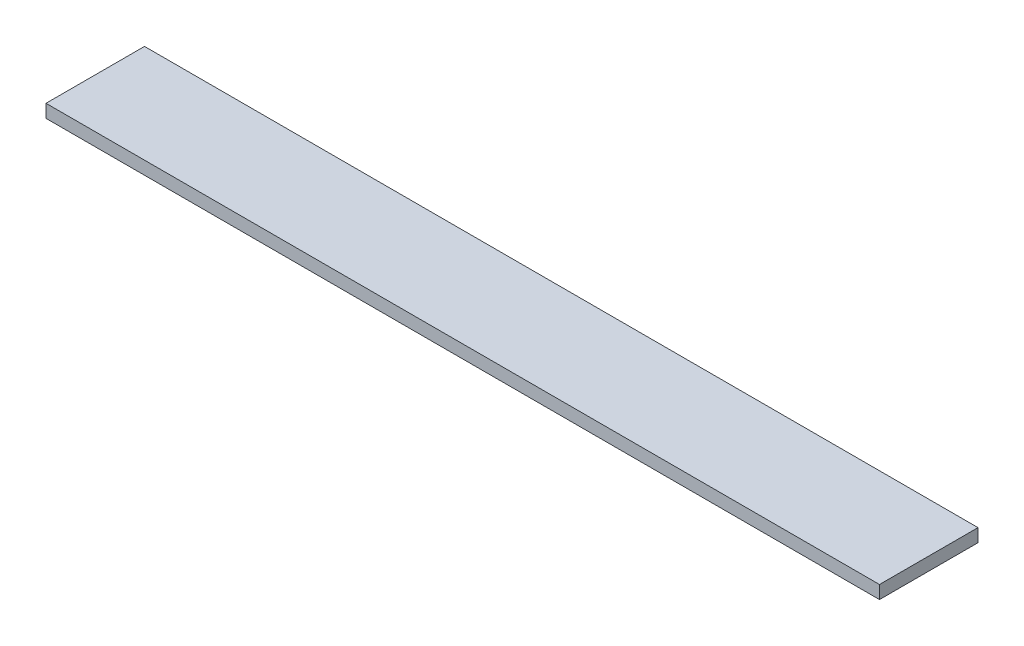
ISO-10303-21;
HEADER;
FILE_DESCRIPTION(('STEP AP214'),'2;1');
FILE_NAME('part.step','',(''),(''),'','','');
FILE_SCHEMA(('AUTOMOTIVE_DESIGN { 1 0 10303 214 1 1 1 1 }'));
ENDSEC;
DATA;
#1=APPLICATION_CONTEXT('core data for automotive mechanical design processes');
#2=APPLICATION_PROTOCOL_DEFINITION('international standard','automotive_design',2000,#1);
#3=PRODUCT_CONTEXT('',#1,'mechanical');
#4=PRODUCT('Part','Part','',(#3));
#5=PRODUCT_RELATED_PRODUCT_CATEGORY('part','',(#4));
#6=PRODUCT_DEFINITION_FORMATION('','',#4);
#7=PRODUCT_DEFINITION_CONTEXT('part definition',#1,'design');
#8=PRODUCT_DEFINITION('design','',#6,#7);
#9=PRODUCT_DEFINITION_SHAPE('','',#8);
#10=(LENGTH_UNIT() NAMED_UNIT(*) SI_UNIT(.MILLI.,.METRE.));
#11=(NAMED_UNIT(*) PLANE_ANGLE_UNIT() SI_UNIT($,.RADIAN.));
#12=(NAMED_UNIT(*) SI_UNIT($,.STERADIAN.) SOLID_ANGLE_UNIT());
#13=UNCERTAINTY_MEASURE_WITH_UNIT(LENGTH_MEASURE(1.E-05),#10,'distance_accuracy_value','');
#14=(GEOMETRIC_REPRESENTATION_CONTEXT(3) GLOBAL_UNCERTAINTY_ASSIGNED_CONTEXT((#13)) GLOBAL_UNIT_ASSIGNED_CONTEXT((#10,
#11,#12)) REPRESENTATION_CONTEXT('',''));
#15=CARTESIAN_POINT('',(0.,0.,0.));
#16=DIRECTION('',(0.,0.,1.));
#17=DIRECTION('',(1.,0.,0.));
#18=AXIS2_PLACEMENT_3D('',#15,#16,#17);
#19=CARTESIAN_POINT('',(541.5,17.,-64.));
#20=DIRECTION('',(-1.,0.,0.));
#21=DIRECTION('',(0.,0.,1.));
#22=AXIS2_PLACEMENT_3D('',#19,#20,#21);
#23=PLANE('',#22);
#24=DIRECTION('',(0.,0.,-1.));
#25=VECTOR('',#24,1.);
#26=CARTESIAN_POINT('',(541.5,0.,-64.));
#27=LINE('',#26,#25);
#28=CARTESIAN_POINT('',(541.5,0.,64.));
#29=VERTEX_POINT('',#28);
#30=CARTESIAN_POINT('',(541.5,0.,-64.));
#31=VERTEX_POINT('',#30);
#32=EDGE_CURVE('E95',#29,#31,#27,.T.);
#33=ORIENTED_EDGE('',*,*,#32,.T.);
#34=DIRECTION('',(0.,-1.,0.));
#35=VECTOR('',#34,1.);
#36=CARTESIAN_POINT('',(541.5,17.,-64.));
#37=LINE('',#36,#35);
#38=CARTESIAN_POINT('',(541.5,17.,-64.));
#39=VERTEX_POINT('',#38);
#40=EDGE_CURVE('E11',#39,#31,#37,.T.);
#41=ORIENTED_EDGE('',*,*,#40,.F.);
#42=DIRECTION('',(0.,0.,-1.));
#43=VECTOR('',#42,1.);
#44=CARTESIAN_POINT('',(541.5,17.,-64.));
#45=LINE('',#44,#43);
#46=CARTESIAN_POINT('',(541.5,17.,64.));
#47=VERTEX_POINT('',#46);
#48=EDGE_CURVE('E83',#47,#39,#45,.T.);
#49=ORIENTED_EDGE('',*,*,#48,.F.);
#50=DIRECTION('',(0.,-1.,0.));
#51=VECTOR('',#50,1.);
#52=CARTESIAN_POINT('',(541.5,17.,64.));
#53=LINE('',#52,#51);
#54=EDGE_CURVE('E91',#47,#29,#53,.T.);
#55=ORIENTED_EDGE('',*,*,#54,.T.);
#56=EDGE_LOOP('',(#33,#41,#49,#55));
#57=FACE_BOUND('',#56,.T.);
#58=ADVANCED_FACE('F32',(#57),#23,.F.);
#59=CARTESIAN_POINT('',(-541.5,17.,-64.));
#60=DIRECTION('',(0.,0.,1.));
#61=DIRECTION('',(1.,0.,0.));
#62=AXIS2_PLACEMENT_3D('',#59,#60,#61);
#63=PLANE('',#62);
#64=DIRECTION('',(-1.,0.,0.));
#65=VECTOR('',#64,1.);
#66=CARTESIAN_POINT('',(-541.5,0.,-64.));
#67=LINE('',#66,#65);
#68=CARTESIAN_POINT('',(-541.5,0.,-64.));
#69=VERTEX_POINT('',#68);
#70=EDGE_CURVE('E87',#31,#69,#67,.T.);
#71=ORIENTED_EDGE('',*,*,#70,.T.);
#72=DIRECTION('',(0.,-1.,0.));
#73=VECTOR('',#72,1.);
#74=CARTESIAN_POINT('',(-541.5,17.,-64.));
#75=LINE('',#74,#73);
#76=CARTESIAN_POINT('',(-541.5,17.,-64.));
#77=VERTEX_POINT('',#76);
#78=EDGE_CURVE('E40',#77,#69,#75,.T.);
#79=ORIENTED_EDGE('',*,*,#78,.F.);
#80=DIRECTION('',(-1.,0.,0.));
#81=VECTOR('',#80,1.);
#82=CARTESIAN_POINT('',(-541.5,17.,-64.));
#83=LINE('',#82,#81);
#84=EDGE_CURVE('E78',#39,#77,#83,.T.);
#85=ORIENTED_EDGE('',*,*,#84,.F.);
#86=ORIENTED_EDGE('',*,*,#40,.T.);
#87=EDGE_LOOP('',(#71,#79,#85,#86));
#88=FACE_BOUND('',#87,.T.);
#89=ADVANCED_FACE('F86',(#88),#63,.F.);
#90=CARTESIAN_POINT('',(-541.5,17.,-64.));
#91=DIRECTION('',(1.,0.,0.));
#92=DIRECTION('',(0.,0.,-1.));
#93=AXIS2_PLACEMENT_3D('',#90,#91,#92);
#94=PLANE('',#93);
#95=DIRECTION('',(0.,0.,1.));
#96=VECTOR('',#95,1.);
#97=CARTESIAN_POINT('',(-541.5,0.,-64.));
#98=LINE('',#97,#96);
#99=CARTESIAN_POINT('',(-541.5,0.,64.));
#100=VERTEX_POINT('',#99);
#101=EDGE_CURVE('E65',#69,#100,#98,.T.);
#102=ORIENTED_EDGE('',*,*,#101,.T.);
#103=DIRECTION('',(0.,-1.,0.));
#104=VECTOR('',#103,1.);
#105=CARTESIAN_POINT('',(-541.5,17.,64.));
#106=LINE('',#105,#104);
#107=CARTESIAN_POINT('',(-541.5,17.,64.));
#108=VERTEX_POINT('',#107);
#109=EDGE_CURVE('E88',#108,#100,#106,.T.);
#110=ORIENTED_EDGE('',*,*,#109,.F.);
#111=DIRECTION('',(0.,0.,1.));
#112=VECTOR('',#111,1.);
#113=CARTESIAN_POINT('',(-541.5,17.,-64.));
#114=LINE('',#113,#112);
#115=EDGE_CURVE('E81',#77,#108,#114,.T.);
#116=ORIENTED_EDGE('',*,*,#115,.F.);
#117=ORIENTED_EDGE('',*,*,#78,.T.);
#118=EDGE_LOOP('',(#102,#110,#116,#117));
#119=FACE_BOUND('',#118,.T.);
#120=ADVANCED_FACE('F89',(#119),#94,.F.);
#121=CARTESIAN_POINT('',(-541.5,17.,64.));
#122=DIRECTION('',(0.,0.,-1.));
#123=DIRECTION('',(-1.,0.,0.));
#124=AXIS2_PLACEMENT_3D('',#121,#122,#123);
#125=PLANE('',#124);
#126=DIRECTION('',(1.,0.,0.));
#127=VECTOR('',#126,1.);
#128=CARTESIAN_POINT('',(-541.5,0.,64.));
#129=LINE('',#128,#127);
#130=EDGE_CURVE('E71',#100,#29,#129,.T.);
#131=ORIENTED_EDGE('',*,*,#130,.T.);
#132=ORIENTED_EDGE('',*,*,#54,.F.);
#133=DIRECTION('',(1.,0.,0.));
#134=VECTOR('',#133,1.);
#135=CARTESIAN_POINT('',(-541.5,17.,64.));
#136=LINE('',#135,#134);
#137=EDGE_CURVE('E48',#108,#47,#136,.T.);
#138=ORIENTED_EDGE('',*,*,#137,.F.);
#139=ORIENTED_EDGE('',*,*,#109,.T.);
#140=EDGE_LOOP('',(#131,#132,#138,#139));
#141=FACE_BOUND('',#140,.T.);
#142=ADVANCED_FACE('F102',(#141),#125,.F.);
#143=CARTESIAN_POINT('',(0.,17.,0.));
#144=DIRECTION('',(0.,1.,0.));
#145=DIRECTION('',(0.,0.,1.));
#146=AXIS2_PLACEMENT_3D('',#143,#144,#145);
#147=PLANE('',#146);
#148=ORIENTED_EDGE('',*,*,#48,.T.);
#149=ORIENTED_EDGE('',*,*,#84,.T.);
#150=ORIENTED_EDGE('',*,*,#115,.T.);
#151=ORIENTED_EDGE('',*,*,#137,.T.);
#152=EDGE_LOOP('',(#148,#149,#150,#151));
#153=FACE_BOUND('',#152,.T.);
#154=ADVANCED_FACE('F79',(#153),#147,.T.);
#155=CARTESIAN_POINT('',(0.,0.,0.));
#156=DIRECTION('',(0.,1.,0.));
#157=DIRECTION('',(0.,0.,1.));
#158=AXIS2_PLACEMENT_3D('',#155,#156,#157);
#159=PLANE('',#158);
#160=ORIENTED_EDGE('',*,*,#32,.F.);
#161=ORIENTED_EDGE('',*,*,#130,.F.);
#162=ORIENTED_EDGE('',*,*,#101,.F.);
#163=ORIENTED_EDGE('',*,*,#70,.F.);
#164=EDGE_LOOP('',(#160,#161,#162,#163));
#165=FACE_BOUND('',#164,.T.);
#166=ADVANCED_FACE('F105',(#165),#159,.F.);
#167=CLOSED_SHELL('',(#58,#89,#120,#142,#154,#166));
#168=MANIFOLD_SOLID_BREP('B2',#167);
#169=ADVANCED_BREP_SHAPE_REPRESENTATION('',(#18,#168),#14);
#170=SHAPE_DEFINITION_REPRESENTATION(#9,#169);
ENDSEC;
END-ISO-10303-21;
